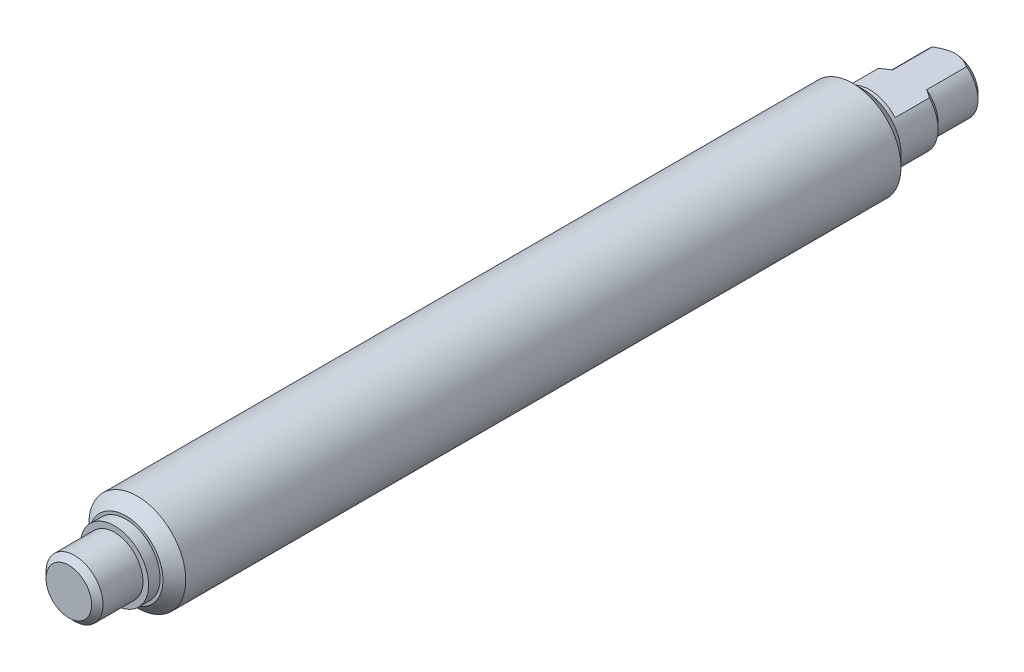
ISO-10303-21;
HEADER;
FILE_DESCRIPTION(('STEP AP214'),'2;1');
FILE_NAME('part.step','',(''),(''),'','','');
FILE_SCHEMA(('AUTOMOTIVE_DESIGN { 1 0 10303 214 1 1 1 1 }'));
ENDSEC;
DATA;
#1=APPLICATION_CONTEXT('core data for automotive mechanical design processes');
#2=APPLICATION_PROTOCOL_DEFINITION('international standard','automotive_design',2000,#1);
#3=PRODUCT_CONTEXT('',#1,'mechanical');
#4=PRODUCT('Part','Part','',(#3));
#5=PRODUCT_RELATED_PRODUCT_CATEGORY('part','',(#4));
#6=PRODUCT_DEFINITION_FORMATION('','',#4);
#7=PRODUCT_DEFINITION_CONTEXT('part definition',#1,'design');
#8=PRODUCT_DEFINITION('design','',#6,#7);
#9=PRODUCT_DEFINITION_SHAPE('','',#8);
#10=(LENGTH_UNIT() NAMED_UNIT(*) SI_UNIT(.MILLI.,.METRE.));
#11=(NAMED_UNIT(*) PLANE_ANGLE_UNIT() SI_UNIT($,.RADIAN.));
#12=(NAMED_UNIT(*) SI_UNIT($,.STERADIAN.) SOLID_ANGLE_UNIT());
#13=UNCERTAINTY_MEASURE_WITH_UNIT(LENGTH_MEASURE(1.E-05),#10,'distance_accuracy_value','');
#14=(GEOMETRIC_REPRESENTATION_CONTEXT(3) GLOBAL_UNCERTAINTY_ASSIGNED_CONTEXT((#13)) GLOBAL_UNIT_ASSIGNED_CONTEXT((#10,
#11,#12)) REPRESENTATION_CONTEXT('',''));
#15=CARTESIAN_POINT('',(0.,0.,0.));
#16=DIRECTION('',(0.,0.,1.));
#17=DIRECTION('',(1.,0.,0.));
#18=AXIS2_PLACEMENT_3D('',#15,#16,#17);
#19=CARTESIAN_POINT('',(0.,0.,-32.35));
#20=DIRECTION('',(0.,0.,1.));
#21=DIRECTION('',(1.,0.,0.));
#22=AXIS2_PLACEMENT_3D('',#19,#20,#21);
#23=PLANE('',#22);
#24=CARTESIAN_POINT('',(0.,0.,-32.35));
#25=DIRECTION('',(0.,0.,1.));
#26=DIRECTION('',(1.,0.,0.));
#27=AXIS2_PLACEMENT_3D('',#24,#25,#26);
#28=CIRCLE('',#27,3.24999999999995);
#29=CARTESIAN_POINT('',(3.24999999999995,0.,-32.35));
#30=VERTEX_POINT('',#29);
#31=EDGE_CURVE('E42',#30,#30,#28,.F.);
#32=ORIENTED_EDGE('',*,*,#31,.T.);
#33=EDGE_LOOP('',(#32));
#34=FACE_BOUND('',#33,.T.);
#35=CARTESIAN_POINT('',(0.,0.,-32.35));
#36=DIRECTION('',(0.,0.,1.));
#37=DIRECTION('',(1.,0.,0.));
#38=AXIS2_PLACEMENT_3D('',#35,#36,#37);
#39=CIRCLE('',#38,3.);
#40=CARTESIAN_POINT('',(3.,0.,-32.35));
#41=VERTEX_POINT('',#40);
#42=EDGE_CURVE('E94',#41,#41,#39,.F.);
#43=ORIENTED_EDGE('',*,*,#42,.F.);
#44=EDGE_LOOP('',(#43));
#45=FACE_BOUND('',#44,.T.);
#46=ADVANCED_FACE('F34',(#34,#45),#23,.F.);
#47=CARTESIAN_POINT('',(0.,0.,33.35));
#48=DIRECTION('',(0.,0.,1.));
#49=DIRECTION('',(1.,0.,0.));
#50=AXIS2_PLACEMENT_3D('',#47,#48,#49);
#51=PLANE('',#50);
#52=CARTESIAN_POINT('',(0.,0.,33.35));
#53=DIRECTION('',(0.,0.,1.));
#54=DIRECTION('',(1.,0.,0.));
#55=AXIS2_PLACEMENT_3D('',#52,#53,#54);
#56=CIRCLE('',#55,3.);
#57=CARTESIAN_POINT('',(3.,0.,33.35));
#58=VERTEX_POINT('',#57);
#59=EDGE_CURVE('E99',#58,#58,#56,.T.);
#60=ORIENTED_EDGE('',*,*,#59,.T.);
#61=EDGE_LOOP('',(#60));
#62=FACE_BOUND('',#61,.T.);
#63=CARTESIAN_POINT('',(0.,0.,33.35));
#64=DIRECTION('',(0.,0.,1.));
#65=DIRECTION('',(1.,0.,0.));
#66=AXIS2_PLACEMENT_3D('',#63,#64,#65);
#67=CIRCLE('',#66,2.5);
#68=CARTESIAN_POINT('',(2.5,0.,33.35));
#69=VERTEX_POINT('',#68);
#70=EDGE_CURVE('E206',#69,#69,#67,.T.);
#71=ORIENTED_EDGE('',*,*,#70,.F.);
#72=EDGE_LOOP('',(#71));
#73=FACE_BOUND('',#72,.T.);
#74=ADVANCED_FACE('F157',(#62,#73),#51,.T.);
#75=CARTESIAN_POINT('',(0.,0.,32.35));
#76=DIRECTION('',(0.,0.,1.));
#77=DIRECTION('',(1.,0.,0.));
#78=AXIS2_PLACEMENT_3D('',#75,#76,#77);
#79=PLANE('',#78);
#80=CARTESIAN_POINT('',(0.,0.,32.35));
#81=DIRECTION('',(0.,0.,1.));
#82=DIRECTION('',(1.,0.,0.));
#83=AXIS2_PLACEMENT_3D('',#80,#81,#82);
#84=CIRCLE('',#83,3.25000000000004);
#85=CARTESIAN_POINT('',(3.25000000000004,0.,32.35));
#86=VERTEX_POINT('',#85);
#87=EDGE_CURVE('E11',#86,#86,#84,.T.);
#88=ORIENTED_EDGE('',*,*,#87,.T.);
#89=EDGE_LOOP('',(#88));
#90=FACE_BOUND('',#89,.T.);
#91=CARTESIAN_POINT('',(0.,0.,32.35));
#92=DIRECTION('',(0.,0.,1.));
#93=DIRECTION('',(1.,0.,0.));
#94=AXIS2_PLACEMENT_3D('',#91,#92,#93);
#95=CIRCLE('',#94,3.);
#96=CARTESIAN_POINT('',(3.,0.,32.35));
#97=VERTEX_POINT('',#96);
#98=EDGE_CURVE('E209',#97,#97,#95,.T.);
#99=ORIENTED_EDGE('',*,*,#98,.F.);
#100=EDGE_LOOP('',(#99));
#101=FACE_BOUND('',#100,.T.);
#102=ADVANCED_FACE('F162',(#90,#101),#79,.T.);
#103=CARTESIAN_POINT('',(0.,0.,32.35));
#104=DIRECTION('',(0.,0.,-1.));
#105=DIRECTION('',(-1.,0.,0.));
#106=AXIS2_PLACEMENT_3D('',#103,#104,#105);
#107=CYLINDRICAL_SURFACE('',#106,4.25);
#108=CARTESIAN_POINT('',(0.,0.,-31.35));
#109=DIRECTION('',(0.,0.,1.));
#110=DIRECTION('',(1.,0.,0.));
#111=AXIS2_PLACEMENT_3D('',#108,#109,#110);
#112=CIRCLE('',#111,4.25);
#113=CARTESIAN_POINT('',(-4.25,0.,-31.35));
#114=VERTEX_POINT('',#113);
#115=EDGE_CURVE('E205',#114,#114,#112,.T.);
#116=CARTESIAN_POINT('',(0.,0.,31.35));
#117=DIRECTION('',(0.,0.,1.));
#118=DIRECTION('',(1.,0.,0.));
#119=AXIS2_PLACEMENT_3D('',#116,#117,#118);
#120=CIRCLE('',#119,4.25);
#121=CARTESIAN_POINT('',(-4.25,0.,31.35));
#122=VERTEX_POINT('',#121);
#123=EDGE_CURVE('E203',#122,#122,#120,.F.);
#124=CARTESIAN_POINT('',(-4.25,0.,-31.35));
#125=CARTESIAN_POINT('',(-4.25,0.,-30.696875));
#126=CARTESIAN_POINT('',(-4.25,0.,-30.04375));
#127=CARTESIAN_POINT('',(-4.25,0.,-28.7375));
#128=CARTESIAN_POINT('',(-4.25,0.,-28.084375));
#129=CARTESIAN_POINT('',(-4.25,0.,-26.778125));
#130=CARTESIAN_POINT('',(-4.25,0.,-26.125));
#131=CARTESIAN_POINT('',(-4.25,0.,-24.81875));
#132=CARTESIAN_POINT('',(-4.25,0.,-24.165625));
#133=CARTESIAN_POINT('',(-4.25,0.,-22.859375));
#134=CARTESIAN_POINT('',(-4.25,0.,-22.20625));
#135=CARTESIAN_POINT('',(-4.25,0.,-20.9));
#136=CARTESIAN_POINT('',(-4.25,0.,-20.246875));
#137=CARTESIAN_POINT('',(-4.25,0.,-18.940625));
#138=CARTESIAN_POINT('',(-4.25,0.,-18.2875));
#139=CARTESIAN_POINT('',(-4.25,0.,-16.98125));
#140=CARTESIAN_POINT('',(-4.25,0.,-16.328125));
#141=CARTESIAN_POINT('',(-4.25,0.,-15.021875));
#142=CARTESIAN_POINT('',(-4.25,0.,-14.36875));
#143=CARTESIAN_POINT('',(-4.25,0.,-13.0625));
#144=CARTESIAN_POINT('',(-4.25,0.,-12.409375));
#145=CARTESIAN_POINT('',(-4.25,0.,-11.103125));
#146=CARTESIAN_POINT('',(-4.25,0.,-10.45));
#147=CARTESIAN_POINT('',(-4.25,0.,-9.14374999999996));
#148=CARTESIAN_POINT('',(-4.25,0.,-8.49062499999996));
#149=CARTESIAN_POINT('',(-4.25,0.,-7.18437499999996));
#150=CARTESIAN_POINT('',(-4.25,0.,-6.53124999999996));
#151=CARTESIAN_POINT('',(-4.25,0.,-5.22499999999996));
#152=CARTESIAN_POINT('',(-4.25,0.,-4.57187499999996));
#153=CARTESIAN_POINT('',(-4.25,0.,-3.26562499999996));
#154=CARTESIAN_POINT('',(-4.25,0.,-2.61249999999996));
#155=CARTESIAN_POINT('',(-4.25,0.,-1.30624999999997));
#156=CARTESIAN_POINT('',(-4.25,0.,-0.653124999999965));
#157=CARTESIAN_POINT('',(-4.25,0.,0.653125000000033));
#158=CARTESIAN_POINT('',(-4.25,0.,1.30625000000003));
#159=CARTESIAN_POINT('',(-4.25,0.,2.61250000000003));
#160=CARTESIAN_POINT('',(-4.25,0.,3.26562500000003));
#161=CARTESIAN_POINT('',(-4.25,0.,4.57187500000003));
#162=CARTESIAN_POINT('',(-4.25,0.,5.22500000000003));
#163=CARTESIAN_POINT('',(-4.25,0.,6.53125000000003));
#164=CARTESIAN_POINT('',(-4.25,0.,7.18437500000003));
#165=CARTESIAN_POINT('',(-4.25,0.,8.49062500000003));
#166=CARTESIAN_POINT('',(-4.25,0.,9.14375000000003));
#167=CARTESIAN_POINT('',(-4.25,0.,10.45));
#168=CARTESIAN_POINT('',(-4.25,0.,11.103125));
#169=CARTESIAN_POINT('',(-4.25,0.,12.409375));
#170=CARTESIAN_POINT('',(-4.25,0.,13.0625));
#171=CARTESIAN_POINT('',(-4.25,0.,14.36875));
#172=CARTESIAN_POINT('',(-4.25,0.,15.021875));
#173=CARTESIAN_POINT('',(-4.25,0.,16.328125));
#174=CARTESIAN_POINT('',(-4.25,0.,16.98125));
#175=CARTESIAN_POINT('',(-4.25,0.,18.2875));
#176=CARTESIAN_POINT('',(-4.25,0.,18.940625));
#177=CARTESIAN_POINT('',(-4.25,0.,20.246875));
#178=CARTESIAN_POINT('',(-4.25,0.,20.9));
#179=CARTESIAN_POINT('',(-4.25,0.,22.20625));
#180=CARTESIAN_POINT('',(-4.25,0.,22.859375));
#181=CARTESIAN_POINT('',(-4.25,0.,24.165625));
#182=CARTESIAN_POINT('',(-4.25,0.,24.81875));
#183=CARTESIAN_POINT('',(-4.25,0.,26.125));
#184=CARTESIAN_POINT('',(-4.25,0.,26.778125));
#185=CARTESIAN_POINT('',(-4.25,0.,28.084375));
#186=CARTESIAN_POINT('',(-4.25,0.,28.7375));
#187=CARTESIAN_POINT('',(-4.25,0.,30.04375));
#188=CARTESIAN_POINT('',(-4.25,0.,30.696875));
#189=CARTESIAN_POINT('',(-4.25,0.,31.35));
#190=B_SPLINE_CURVE_WITH_KNOTS('',3,(#124,#125,#126,#127,#128,#129,#130,#131,#132,#133,#134,
#135,#136,#137,#138,#139,#140,#141,#142,#143,#144,#145,#146,#147,#148,#149,#150,#151,#152,#153,
#154,#155,#156,#157,#158,#159,#160,#161,#162,#163,#164,#165,#166,#167,#168,#169,#170,#171,#172,
#173,#174,#175,#176,#177,#178,#179,#180,#181,#182,#183,#184,#185,#186,#187,#188,#189),
.UNSPECIFIED.,.F.,.F.,(4,2,2,2,2,2,2,2,2,2,2,2,2,2,2,2,2,2,2,2,2,2,2,2,2,2,2,2,2,2,2,2,4),(0.,
1.95937499999999,3.91874999999999,5.87812499999999,7.83749999999999,9.79687499999999,11.75625,
13.715625,15.675,17.634375,19.59375,21.553125,23.5125,25.471875,27.43125,29.390625,31.35,
33.309375,35.26875,37.228125,39.1875,41.146875,43.10625,45.065625,47.025,48.984375,50.94375,
52.903125,54.8625,56.821875,58.78125,60.740625,62.7),.UNSPECIFIED.);
#191=EDGE_CURVE('BSEAM146',#114,#122,#190,.T.);
#192=ORIENTED_EDGE('',*,*,#115,.T.);
#193=ORIENTED_EDGE('',*,*,#123,.T.);
#194=ORIENTED_EDGE('',*,*,#191,.T.);
#195=ORIENTED_EDGE('',*,*,#191,.F.);
#196=EDGE_LOOP('',(#192,#194,#193,#195));
#197=FACE_BOUND('',#196,.T.);
#198=ADVANCED_FACE('F146',(#197),#107,.T.);
#199=CARTESIAN_POINT('',(0.,0.,33.35));
#200=DIRECTION('',(0.,0.,-1.));
#201=DIRECTION('',(-1.,0.,0.));
#202=AXIS2_PLACEMENT_3D('',#199,#200,#201);
#203=CYLINDRICAL_SURFACE('',#202,3.);
#204=ORIENTED_EDGE('',*,*,#59,.F.);
#205=EDGE_LOOP('',(#204));
#206=FACE_BOUND('',#205,.T.);
#207=ORIENTED_EDGE('',*,*,#98,.T.);
#208=EDGE_LOOP('',(#207));
#209=FACE_BOUND('',#208,.T.);
#210=ADVANCED_FACE('F171',(#206,#209),#203,.T.);
#211=CARTESIAN_POINT('',(0.,0.,37.35));
#212=DIRECTION('',(0.,0.,-1.));
#213=DIRECTION('',(-1.,0.,0.));
#214=AXIS2_PLACEMENT_3D('',#211,#212,#213);
#215=CYLINDRICAL_SURFACE('',#214,2.5);
#216=CARTESIAN_POINT('',(0.,0.,36.85));
#217=DIRECTION('',(0.,0.,1.));
#218=DIRECTION('',(1.,0.,0.));
#219=AXIS2_PLACEMENT_3D('',#216,#217,#218);
#220=CIRCLE('',#219,2.5);
#221=CARTESIAN_POINT('',(2.5,0.,36.85));
#222=VERTEX_POINT('',#221);
#223=EDGE_CURVE('E105',#222,#222,#220,.F.);
#224=ORIENTED_EDGE('',*,*,#223,.T.);
#225=EDGE_LOOP('',(#224));
#226=FACE_BOUND('',#225,.T.);
#227=ORIENTED_EDGE('',*,*,#70,.T.);
#228=EDGE_LOOP('',(#227));
#229=FACE_BOUND('',#228,.T.);
#230=ADVANCED_FACE('F173',(#226,#229),#215,.T.);
#231=CARTESIAN_POINT('',(0.,0.,37.35));
#232=DIRECTION('',(0.,0.,1.));
#233=DIRECTION('',(1.,0.,0.));
#234=AXIS2_PLACEMENT_3D('',#231,#232,#233);
#235=PLANE('',#234);
#236=CARTESIAN_POINT('',(0.,0.,37.35));
#237=DIRECTION('',(0.,0.,1.));
#238=DIRECTION('',(1.,0.,0.));
#239=AXIS2_PLACEMENT_3D('',#236,#237,#238);
#240=CIRCLE('',#239,2.);
#241=CARTESIAN_POINT('',(2.,0.,37.35));
#242=VERTEX_POINT('',#241);
#243=EDGE_CURVE('E96',#242,#242,#240,.T.);
#244=ORIENTED_EDGE('',*,*,#243,.T.);
#245=EDGE_LOOP('',(#244));
#246=FACE_BOUND('',#245,.T.);
#247=ADVANCED_FACE('F178',(#246),#235,.T.);
#248=CARTESIAN_POINT('',(0.,0.,-36.35));
#249=DIRECTION('',(0.,0.,1.));
#250=DIRECTION('',(1.,0.,0.));
#251=AXIS2_PLACEMENT_3D('',#248,#249,#250);
#252=CYLINDRICAL_SURFACE('',#251,3.);
#253=CARTESIAN_POINT('',(0.,0.,-35.85));
#254=DIRECTION('',(0.,0.,-1.));
#255=DIRECTION('',(-1.,0.,0.));
#256=AXIS2_PLACEMENT_3D('',#253,#254,#255);
#257=CIRCLE('',#256,3.);
#258=CARTESIAN_POINT('',(-2.23606797749979,2.,-35.85));
#259=VERTEX_POINT('',#258);
#260=CARTESIAN_POINT('',(2.23606797749979,2.,-35.85));
#261=VERTEX_POINT('',#260);
#262=EDGE_CURVE('E108',#259,#261,#257,.F.);
#263=ORIENTED_EDGE('',*,*,#262,.T.);
#264=DIRECTION('',(0.,0.,1.));
#265=VECTOR('',#264,1.);
#266=CARTESIAN_POINT('',(2.23606797749979,2.,-36.35));
#267=LINE('',#266,#265);
#268=CARTESIAN_POINT('',(2.23606797749979,2.,-32.85));
#269=VERTEX_POINT('',#268);
#270=EDGE_CURVE('E56',#261,#269,#267,.T.);
#271=ORIENTED_EDGE('',*,*,#270,.T.);
#272=CARTESIAN_POINT('',(0.,0.,-32.85));
#273=DIRECTION('',(0.,0.,-1.));
#274=DIRECTION('',(-1.,0.,0.));
#275=AXIS2_PLACEMENT_3D('',#272,#273,#274);
#276=CIRCLE('',#275,3.);
#277=CARTESIAN_POINT('',(-2.23606797749979,2.,-32.85));
#278=VERTEX_POINT('',#277);
#279=EDGE_CURVE('E120',#278,#269,#276,.T.);
#280=ORIENTED_EDGE('',*,*,#279,.F.);
#281=DIRECTION('',(0.,0.,1.));
#282=VECTOR('',#281,1.);
#283=CARTESIAN_POINT('',(-2.23606797749979,2.,-36.35));
#284=LINE('',#283,#282);
#285=EDGE_CURVE('E91',#278,#259,#284,.F.);
#286=ORIENTED_EDGE('',*,*,#285,.T.);
#287=EDGE_LOOP('',(#263,#271,#280,#286));
#288=FACE_BOUND('',#287,.T.);
#289=ORIENTED_EDGE('',*,*,#42,.T.);
#290=EDGE_LOOP('',(#289));
#291=FACE_BOUND('',#290,.T.);
#292=ADVANCED_FACE('F182',(#288,#291),#252,.T.);
#293=CARTESIAN_POINT('',(0.,0.,-40.35));
#294=DIRECTION('',(0.,0.,1.));
#295=DIRECTION('',(1.,0.,0.));
#296=AXIS2_PLACEMENT_3D('',#293,#294,#295);
#297=CYLINDRICAL_SURFACE('',#296,2.5);
#298=CARTESIAN_POINT('',(0.,0.,-39.85));
#299=DIRECTION('',(0.,0.,-1.));
#300=DIRECTION('',(-1.,0.,0.));
#301=AXIS2_PLACEMENT_3D('',#298,#299,#300);
#302=CIRCLE('',#301,2.5);
#303=CARTESIAN_POINT('',(-1.5,2.,-39.85));
#304=VERTEX_POINT('',#303);
#305=CARTESIAN_POINT('',(1.5,2.,-39.85));
#306=VERTEX_POINT('',#305);
#307=EDGE_CURVE('E90',#304,#306,#302,.F.);
#308=ORIENTED_EDGE('',*,*,#307,.T.);
#309=DIRECTION('',(0.,0.,1.));
#310=VECTOR('',#309,1.);
#311=CARTESIAN_POINT('',(1.5,2.,-40.35));
#312=LINE('',#311,#310);
#313=CARTESIAN_POINT('',(1.5,2.,-36.35));
#314=VERTEX_POINT('',#313);
#315=EDGE_CURVE('E81',#306,#314,#312,.T.);
#316=ORIENTED_EDGE('',*,*,#315,.T.);
#317=CARTESIAN_POINT('',(0.,0.,-36.35));
#318=DIRECTION('',(0.,0.,-1.));
#319=DIRECTION('',(-1.,0.,0.));
#320=AXIS2_PLACEMENT_3D('',#317,#318,#319);
#321=CIRCLE('',#320,2.5);
#322=CARTESIAN_POINT('',(-1.5,2.,-36.35));
#323=VERTEX_POINT('',#322);
#324=EDGE_CURVE('E194',#314,#323,#321,.T.);
#325=ORIENTED_EDGE('',*,*,#324,.T.);
#326=DIRECTION('',(0.,0.,1.));
#327=VECTOR('',#326,1.);
#328=CARTESIAN_POINT('',(-1.5,2.,-40.35));
#329=LINE('',#328,#327);
#330=EDGE_CURVE('E49',#323,#304,#329,.F.);
#331=ORIENTED_EDGE('',*,*,#330,.T.);
#332=EDGE_LOOP('',(#308,#316,#325,#331));
#333=FACE_BOUND('',#332,.T.);
#334=ADVANCED_FACE('F185',(#333),#297,.T.);
#335=CARTESIAN_POINT('',(0.,0.,-40.35));
#336=DIRECTION('',(0.,0.,-1.));
#337=DIRECTION('',(-1.,0.,0.));
#338=AXIS2_PLACEMENT_3D('',#335,#336,#337);
#339=PLANE('',#338);
#340=CARTESIAN_POINT('',(0.,0.,-40.35));
#341=DIRECTION('',(0.,0.,-1.));
#342=DIRECTION('',(-1.,0.,0.));
#343=AXIS2_PLACEMENT_3D('',#340,#341,#342);
#344=CIRCLE('',#343,2.);
#345=CARTESIAN_POINT('',(0.,2.,-40.35));
#346=VERTEX_POINT('',#345);
#347=EDGE_CURVE('E89',#346,#346,#344,.T.);
#348=ORIENTED_EDGE('',*,*,#347,.T.);
#349=EDGE_LOOP('',(#348));
#350=FACE_BOUND('',#349,.T.);
#351=ADVANCED_FACE('F93',(#350),#339,.T.);
#352=CARTESIAN_POINT('',(0.,0.,-40.35));
#353=DIRECTION('',(0.,0.,1.));
#354=DIRECTION('',(1.,0.,0.));
#355=AXIS2_PLACEMENT_3D('',#352,#353,#354);
#356=CONICAL_SURFACE('',#355,2.,0.785398163397446);
#357=CARTESIAN_POINT('',(-4.02524487287733,2.,-37.8552701653353));
#358=CARTESIAN_POINT('',(-3.93338656559503,2.,-37.9375217206694));
#359=CARTESIAN_POINT('',(-3.84126127996534,2.,-38.0194777630483));
#360=CARTESIAN_POINT('',(-3.65633622016193,2.,-38.1826420150682));
#361=CARTESIAN_POINT('',(-3.56353638507523,2.,-38.2638501556327));
#362=CARTESIAN_POINT('',(-3.3767906548413,2.,-38.4256480230057));
#363=CARTESIAN_POINT('',(-3.28284177522376,2.,-38.5062343111819));
#364=CARTESIAN_POINT('',(-3.09396170046439,2.,-38.666241356936));
#365=CARTESIAN_POINT('',(-2.9990305459873,2.,-38.7456621624367));
#366=CARTESIAN_POINT('',(-2.80231868574971,2.,-38.9076618695362));
#367=CARTESIAN_POINT('',(-2.7004639581137,2.,-38.9901511403073));
#368=CARTESIAN_POINT('',(-2.49502065799541,2.,-39.1529394966641));
#369=CARTESIAN_POINT('',(-2.39143218029121,2.,-39.2332387013461));
#370=CARTESIAN_POINT('',(-2.18217141569413,2.,-39.3907552208728));
#371=CARTESIAN_POINT('',(-2.07650249233657,2.,-39.4679769835109));
#372=CARTESIAN_POINT('',(-1.86228016066993,2.,-39.6182890730739));
#373=CARTESIAN_POINT('',(-1.7537276355555,2.,-39.6913806440338));
#374=CARTESIAN_POINT('',(-1.56257875752936,2.,-39.8127220691165));
#375=CARTESIAN_POINT('',(-1.48086803544078,2.,-39.8623596167979));
#376=CARTESIAN_POINT('',(-1.31495821323154,2.,-39.9574104299911));
#377=CARTESIAN_POINT('',(-1.23075822227052,2.,-40.0028221584837));
#378=CARTESIAN_POINT('',(-1.0602390235546,2.,-40.0875500940183));
#379=CARTESIAN_POINT('',(-0.973945152787861,2.,-40.1269166708474));
#380=CARTESIAN_POINT('',(-0.798278775330236,2.,-40.1980658869434));
#381=CARTESIAN_POINT('',(-0.708908734252927,2.,-40.2298544452973));
#382=CARTESIAN_POINT('',(-0.559541387776277,2.,-40.2739554616646));
#383=CARTESIAN_POINT('',(-0.50040304542848,2.,-40.2891736445886));
#384=CARTESIAN_POINT('',(-0.381108626655476,2.,-40.3148450536554));
#385=CARTESIAN_POINT('',(-0.320952978782924,2.,-40.325300236847));
#386=CARTESIAN_POINT('',(-0.200181452597919,2.,-40.3408949804001));
#387=CARTESIAN_POINT('',(-0.139568224383838,2.,-40.3460547746351));
#388=CARTESIAN_POINT('',(-0.0181203079271015,2.,-40.3508382229008));
#389=CARTESIAN_POINT('',(0.0427143780219843,2.,-40.3504619341048));
#390=CARTESIAN_POINT('',(0.163839037596729,2.,-40.344208583769));
#391=CARTESIAN_POINT('',(0.224130225918217,2.,-40.3383546366807));
#392=CARTESIAN_POINT('',(0.343991547443568,2.,-40.3215015109566));
#393=CARTESIAN_POINT('',(0.403561514966866,2.,-40.3105011722532));
#394=CARTESIAN_POINT('',(0.522342234602082,2.,-40.2837349239597));
#395=CARTESIAN_POINT('',(0.581540567552806,2.,-40.2679146042934));
#396=CARTESIAN_POINT('',(0.698671365380821,2.,-40.2322112796639));
#397=CARTESIAN_POINT('',(0.756604050119149,2.,-40.2123289866356));
#398=CARTESIAN_POINT('',(0.887860927745208,2.,-40.1628560581075));
#399=CARTESIAN_POINT('',(0.960752844289918,2.,-40.1321244984101));
#400=CARTESIAN_POINT('',(1.10449637010201,2.,-40.0661808969026));
#401=CARTESIAN_POINT('',(1.17534687727417,2.,-40.0309664885298));
#402=CARTESIAN_POINT('',(1.31542984339306,2.,-39.9569247865524));
#403=CARTESIAN_POINT('',(1.38465593395356,2.,-39.9180855391967));
#404=CARTESIAN_POINT('',(1.52149299869852,2.,-39.8376549997551));
#405=CARTESIAN_POINT('',(1.5891037320263,2.,-39.7960633007095));
#406=CARTESIAN_POINT('',(1.71962468526393,2.,-39.712821493367));
#407=CARTESIAN_POINT('',(1.7826019928183,2.,-39.6712760281911));
#408=CARTESIAN_POINT('',(1.90748425118692,2.,-39.5865978718585));
#409=CARTESIAN_POINT('',(1.96938911660695,2.,-39.5434650551541));
#410=CARTESIAN_POINT('',(2.09174110166181,2.,-39.4562912155001));
#411=CARTESIAN_POINT('',(2.1521962243786,2.,-39.4122613860916));
#412=CARTESIAN_POINT('',(2.27230748022892,2.,-39.3231570679659));
#413=CARTESIAN_POINT('',(2.33196382265282,2.,-39.2780828616878));
#414=CARTESIAN_POINT('',(2.39129047517801,2.,-39.2325859856803));
#415=B_SPLINE_CURVE_WITH_KNOTS('',3,(#357,#358,#359,#360,#361,#362,#363,#364,#365,#366,#367,
#368,#369,#370,#371,#372,#373,#374,#375,#376,#377,#378,#379,#380,#381,#382,#383,#384,#385,#386,
#387,#388,#389,#390,#391,#392,#393,#394,#395,#396,#397,#398,#399,#400,#401,#402,#403,#404,#405,
#406,#407,#408,#409,#410,#411,#412,#413,#414),.UNSPECIFIED.,.F.,.F.,(4,2,2,2,2,2,2,2,2,2,2,2,2,
2,2,2,2,2,2,2,2,2,2,2,2,2,2,2,4),(0.,0.369906577290639,0.739846983359823,1.11116790415775,
1.4824735138239,1.87565592605001,2.26881691411835,2.66138738129622,3.05383896694484,
3.3405655856176,3.6273960884676,3.91168916131591,4.19575944375506,4.37878987167405,
4.56174502701619,4.74399847152468,4.92625003382967,5.10773598829821,5.28926287192775,
5.47292001224291,5.65654499086523,5.89365897291803,6.13089865416211,6.36895036811943,
6.60703735784731,6.83334806436317,7.05967670901758,7.28403255416346,7.50832841730329),.UNSPECIFIED.);
#416=EDGE_CURVE('E76',#306,#346,#415,.F.);
#417=ORIENTED_EDGE('',*,*,#416,.F.);
#418=ORIENTED_EDGE('',*,*,#307,.F.);
#419=EDGE_CURVE('E79',#346,#304,#415,.F.);
#420=ORIENTED_EDGE('',*,*,#419,.F.);
#421=ORIENTED_EDGE('',*,*,#347,.F.);
#422=EDGE_LOOP('',(#417,#418,#420,#421));
#423=FACE_BOUND('',#422,.T.);
#424=ADVANCED_FACE('F88',(#423),#356,.T.);
#425=CARTESIAN_POINT('',(0.,0.,37.35));
#426=DIRECTION('',(0.,0.,-1.));
#427=DIRECTION('',(-1.,0.,0.));
#428=AXIS2_PLACEMENT_3D('',#425,#426,#427);
#429=CONICAL_SURFACE('',#428,2.,0.785398163397446);
#430=ORIENTED_EDGE('',*,*,#223,.F.);
#431=EDGE_LOOP('',(#430));
#432=FACE_BOUND('',#431,.T.);
#433=ORIENTED_EDGE('',*,*,#243,.F.);
#434=EDGE_LOOP('',(#433));
#435=FACE_BOUND('',#434,.T.);
#436=ADVANCED_FACE('F145',(#432,#435),#429,.T.);
#437=CARTESIAN_POINT('',(0.,0.,-36.35));
#438=DIRECTION('',(0.,0.,1.));
#439=DIRECTION('',(1.,0.,0.));
#440=AXIS2_PLACEMENT_3D('',#437,#438,#439);
#441=CONICAL_SURFACE('',#440,2.50000000000001,0.785398163397446);
#442=CARTESIAN_POINT('',(6.30297669939968,2.,-32.2373216263623));
#443=CARTESIAN_POINT('',(6.19161538231918,2.,-32.3434654188677));
#444=CARTESIAN_POINT('',(6.08012784166971,2.,-32.4494766865766));
#445=CARTESIAN_POINT('',(5.85685182740817,2.,-32.6611832346176));
#446=CARTESIAN_POINT('',(5.74506335186332,2.,-32.766878512911));
#447=CARTESIAN_POINT('',(5.40910374007518,2.,-33.0834799534095));
#448=CARTESIAN_POINT('',(5.18441017570402,2.,-33.2938332007284));
#449=CARTESIAN_POINT('',(4.73080338017172,2.,-33.7145130906793));
#450=CARTESIAN_POINT('',(4.50187041839722,2.,-33.9248184834026));
#451=CARTESIAN_POINT('',(4.04109600653748,2.,-34.3421398339185));
#452=CARTESIAN_POINT('',(3.80925519025911,2.,-34.5491564869832));
#453=CARTESIAN_POINT('',(3.41557477398931,2.,-34.8927094339617));
#454=CARTESIAN_POINT('',(3.25498354268553,2.,-35.0306734892414));
#455=CARTESIAN_POINT('',(2.93065759329855,2.,-35.3030414106355));
#456=CARTESIAN_POINT('',(2.76692149007149,2.,-35.4374436429248));
#457=CARTESIAN_POINT('',(2.51812669562768,2.,-35.6346540132489));
#458=CARTESIAN_POINT('',(2.43475662118926,2.,-35.699589732802));
#459=CARTESIAN_POINT('',(2.26663374732053,2.,-35.8276417312762));
#460=CARTESIAN_POINT('',(2.18188103848766,2.,-35.8907581286649));
#461=CARTESIAN_POINT('',(2.01072574565113,2.,-36.0145933363178));
#462=CARTESIAN_POINT('',(1.92432436509382,2.,-36.0753138031099));
#463=CARTESIAN_POINT('',(1.74941695008944,2.,-36.1936296466813));
#464=CARTESIAN_POINT('',(1.66091137740147,2.,-36.2512257001645));
#465=CARTESIAN_POINT('',(1.50227028732201,2.,-36.3492212710428));
#466=CARTESIAN_POINT('',(1.43267637104483,2.,-36.3904935943275));
#467=CARTESIAN_POINT('',(1.29167710661273,2.,-36.4698677964186));
#468=CARTESIAN_POINT('',(1.22027148128106,2.,-36.5079691862348));
#469=CARTESIAN_POINT('',(1.07546452699154,2.,-36.5800460130543));
#470=CARTESIAN_POINT('',(1.00206522711483,2.,-36.6140254658396));
#471=CARTESIAN_POINT('',(0.85308114294913,2.,-36.6767151787812));
#472=CARTESIAN_POINT('',(0.777497091069874,2.,-36.7054271816018));
#473=CARTESIAN_POINT('',(0.584403393214613,2.,-36.7692396638116));
#474=CARTESIAN_POINT('',(0.465352306558779,2.,-36.8000128348776));
#475=CARTESIAN_POINT('',(0.284397555948297,2.,-36.8307588195802));
#476=CARTESIAN_POINT('',(0.223763847529523,2.,-36.838438502314));
#477=CARTESIAN_POINT('',(0.102037460980267,2.,-36.8483151195683));
#478=CARTESIAN_POINT('',(0.0409448065906474,2.,-36.8505123357594));
#479=CARTESIAN_POINT('',(-0.0813412240179714,2.,-36.8492836906337));
#480=CARTESIAN_POINT('',(-0.142534443443011,2.,-36.8458430479095));
#481=CARTESIAN_POINT('',(-0.264365149349671,2.,-36.8335143071468));
#482=CARTESIAN_POINT('',(-0.325002595336195,2.,-36.8246258153165));
#483=CARTESIAN_POINT('',(-0.445513581328048,2.,-36.8018382366568));
#484=CARTESIAN_POINT('',(-0.505384108194592,2.,-36.787923432345));
#485=CARTESIAN_POINT('',(-0.623920460080767,2.,-36.7557165246167));
#486=CARTESIAN_POINT('',(-0.682586214925812,2.,-36.7374241670009));
#487=CARTESIAN_POINT('',(-0.870096679141481,2.,-36.6723195036355));
#488=CARTESIAN_POINT('',(-0.996380524334725,2.,-36.6181300929727));
#489=CARTESIAN_POINT('',(-1.24305957355027,2.,-36.4976478589649));
#490=CARTESIAN_POINT('',(-1.36344236007697,2.,-36.4313307945582));
#491=CARTESIAN_POINT('',(-1.60114682986083,2.,-36.2898352181217));
#492=CARTESIAN_POINT('',(-1.71840078274329,2.,-36.2145442578527));
#493=CARTESIAN_POINT('',(-1.89143789202116,2.,-36.0975913945842));
#494=CARTESIAN_POINT('',(-1.94861845845233,2.,-36.057955998579));
#495=CARTESIAN_POINT('',(-2.06217670530473,2.,-35.9775512752209));
#496=CARTESIAN_POINT('',(-2.11855440502151,2.,-35.9367819751893));
#497=CARTESIAN_POINT('',(-2.27151937990447,2.,-35.824196769287));
#498=CARTESIAN_POINT('',(-2.36741546158162,2.,-35.7514431443246));
#499=CARTESIAN_POINT('',(-2.55757734840229,2.,-35.6038303699529));
#500=CARTESIAN_POINT('',(-2.65184301372993,2.,-35.5289710414011));
#501=CARTESIAN_POINT('',(-2.83909574994455,2.,-35.3776197624691));
#502=CARTESIAN_POINT('',(-2.93208245025614,2.,-35.3011273546395));
#503=CARTESIAN_POINT('',(-3.11700238327254,2.,-35.1468779319394));
#504=CARTESIAN_POINT('',(-3.20893558912926,2.,-35.0691208849615));
#505=CARTESIAN_POINT('',(-3.48375900151843,2.,-34.8340952575393));
#506=CARTESIAN_POINT('',(-3.66536407471734,2.,-34.6753249307297));
#507=CARTESIAN_POINT('',(-4.02619748135239,2.,-34.3551814767041));
#508=CARTESIAN_POINT('',(-4.20542620770821,2.,-34.1938087898096));
#509=CARTESIAN_POINT('',(-4.54602117157569,2.,-33.883936581731));
#510=CARTESIAN_POINT('',(-4.70753312366636,2.,-33.7355969838316));
#511=CARTESIAN_POINT('',(-5.02950930464931,2.,-33.4377703518185));
#512=CARTESIAN_POINT('',(-5.18997348014396,2.,-33.288283260057));
#513=CARTESIAN_POINT('',(-5.50956314093422,2.,-32.9889288168519));
#514=CARTESIAN_POINT('',(-5.66869128700742,2.,-32.8390643030356));
#515=CARTESIAN_POINT('',(-5.9862866472159,2.,-32.5386586900714));
#516=CARTESIAN_POINT('',(-6.14475390713847,2.,-32.3881176393484));
#517=CARTESIAN_POINT('',(-6.30297669939968,2.,-32.2373216263623));
#518=B_SPLINE_CURVE_WITH_KNOTS('',3,(#442,#443,#444,#445,#446,#447,#448,#449,#450,#451,#452,
#453,#454,#455,#456,#457,#458,#459,#460,#461,#462,#463,#464,#465,#466,#467,#468,#469,#470,#471,
#472,#473,#474,#475,#476,#477,#478,#479,#480,#481,#482,#483,#484,#485,#486,#487,#488,#489,#490,
#491,#492,#493,#494,#495,#496,#497,#498,#499,#500,#501,#502,#503,#504,#505,#506,#507,#508,#509,
#510,#511,#512,#513,#514,#515,#516,#517),.UNSPECIFIED.,.F.,.F.,(4,2,2,2,2,2,2,2,2,2,2,2,2,2,2,2,
2,2,2,2,2,2,2,2,2,2,2,2,2,2,2,2,2,2,2,2,2,4),(0.,0.46153039584807,0.923063762999831,
1.84642814570779,2.7790149413771,3.71140188239741,4.34652018448135,4.98192494520126,
5.29893184459039,5.61591805480019,5.93268111936179,6.24937530133097,6.49204579715625,
6.73475364617269,6.97722310585572,7.21961220258093,7.5868550244872,7.76999772547683,
7.95313101701504,8.13674521833653,8.32037269357644,8.50457942200897,8.6887968497066,
9.09991327785318,9.51186062066998,9.92965689883885,10.1383717107001,10.3470814979544,
10.7081519451168,11.0692532037656,11.4304569749129,11.7916699308902,12.5152929670805,
13.2387948242448,13.8966755650346,14.5545895756196,15.2103542781077,15.8660727671492),.UNSPECIFIED.);
#519=EDGE_CURVE('E119',#261,#314,#518,.T.);
#520=ORIENTED_EDGE('',*,*,#519,.F.);
#521=ORIENTED_EDGE('',*,*,#262,.F.);
#522=EDGE_CURVE('E111',#323,#259,#518,.T.);
#523=ORIENTED_EDGE('',*,*,#522,.F.);
#524=ORIENTED_EDGE('',*,*,#324,.F.);
#525=EDGE_LOOP('',(#520,#521,#523,#524));
#526=FACE_BOUND('',#525,.T.);
#527=ADVANCED_FACE('F122',(#526),#441,.T.);
#528=CARTESIAN_POINT('',(3.,2.,-32.85));
#529=DIRECTION('',(0.,0.,-1.));
#530=DIRECTION('',(-1.,0.,0.));
#531=AXIS2_PLACEMENT_3D('',#528,#529,#530);
#532=PLANE('',#531);
#533=ORIENTED_EDGE('',*,*,#279,.T.);
#534=DIRECTION('',(-1.,0.,0.));
#535=VECTOR('',#534,1.);
#536=CARTESIAN_POINT('',(3.,2.,-32.85));
#537=LINE('',#536,#535);
#538=EDGE_CURVE('E195',#269,#278,#537,.T.);
#539=ORIENTED_EDGE('',*,*,#538,.T.);
#540=EDGE_LOOP('',(#533,#539));
#541=FACE_BOUND('',#540,.T.);
#542=ADVANCED_FACE('F130',(#541),#532,.T.);
#543=CARTESIAN_POINT('',(3.,2.,-32.85));
#544=DIRECTION('',(0.,-1.,0.));
#545=DIRECTION('',(0.,0.,-1.));
#546=AXIS2_PLACEMENT_3D('',#543,#544,#545);
#547=PLANE('',#546);
#548=ORIENTED_EDGE('',*,*,#519,.T.);
#549=ORIENTED_EDGE('',*,*,#315,.F.);
#550=ORIENTED_EDGE('',*,*,#416,.T.);
#551=ORIENTED_EDGE('',*,*,#419,.T.);
#552=ORIENTED_EDGE('',*,*,#330,.F.);
#553=ORIENTED_EDGE('',*,*,#522,.T.);
#554=ORIENTED_EDGE('',*,*,#285,.F.);
#555=ORIENTED_EDGE('',*,*,#538,.F.);
#556=ORIENTED_EDGE('',*,*,#270,.F.);
#557=EDGE_LOOP('',(#548,#549,#550,#551,#552,#553,#554,#555,#556));
#558=FACE_BOUND('',#557,.T.);
#559=ADVANCED_FACE('F78',(#558),#547,.F.);
#560=CARTESIAN_POINT('',(0.,0.,-31.35));
#561=DIRECTION('',(0.,0.,1.));
#562=DIRECTION('',(1.,0.,0.));
#563=AXIS2_PLACEMENT_3D('',#560,#561,#562);
#564=CONICAL_SURFACE('',#563,4.25,0.785398163397454);
#565=ORIENTED_EDGE('',*,*,#31,.F.);
#566=EDGE_LOOP('',(#565));
#567=FACE_BOUND('',#566,.T.);
#568=ORIENTED_EDGE('',*,*,#115,.F.);
#569=EDGE_LOOP('',(#568));
#570=FACE_BOUND('',#569,.T.);
#571=ADVANCED_FACE('F129',(#567,#570),#564,.T.);
#572=CARTESIAN_POINT('',(0.,0.,32.35));
#573=DIRECTION('',(0.,0.,-1.));
#574=DIRECTION('',(-1.,0.,0.));
#575=AXIS2_PLACEMENT_3D('',#572,#573,#574);
#576=CONICAL_SURFACE('',#575,3.25000000000004,0.785398163397444);
#577=ORIENTED_EDGE('',*,*,#123,.F.);
#578=EDGE_LOOP('',(#577));
#579=FACE_BOUND('',#578,.T.);
#580=ORIENTED_EDGE('',*,*,#87,.F.);
#581=EDGE_LOOP('',(#580));
#582=FACE_BOUND('',#581,.T.);
#583=ADVANCED_FACE('F36',(#579,#582),#576,.T.);
#584=CLOSED_SHELL('',(#46,#74,#102,#198,#210,#230,#247,#292,#334,#351,#424,#436,#527,#542,#559,
#571,#583));
#585=MANIFOLD_SOLID_BREP('B2',#584);
#586=ADVANCED_BREP_SHAPE_REPRESENTATION('',(#18,#585),#14);
#587=SHAPE_DEFINITION_REPRESENTATION(#9,#586);
ENDSEC;
END-ISO-10303-21;
